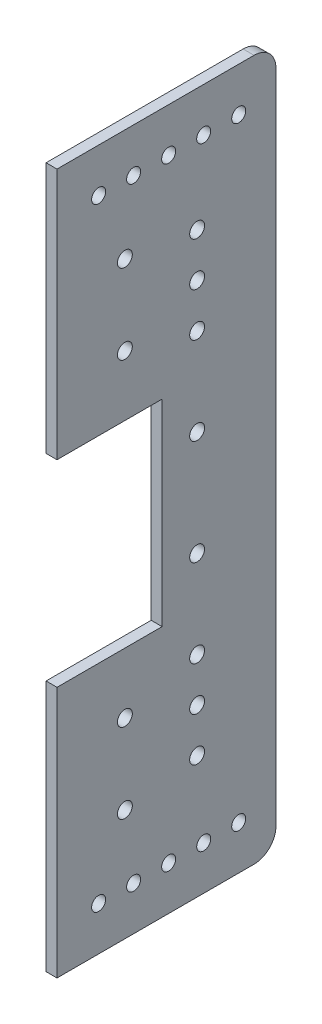
ISO-10303-21;
HEADER;
FILE_DESCRIPTION(('STEP AP214'),'2;1');
FILE_NAME('part.step','',(''),(''),'','','');
FILE_SCHEMA(('AUTOMOTIVE_DESIGN { 1 0 10303 214 1 1 1 1 }'));
ENDSEC;
DATA;
#1=APPLICATION_CONTEXT('core data for automotive mechanical design processes');
#2=APPLICATION_PROTOCOL_DEFINITION('international standard','automotive_design',2000,#1);
#3=PRODUCT_CONTEXT('',#1,'mechanical');
#4=PRODUCT('Part','Part','',(#3));
#5=PRODUCT_RELATED_PRODUCT_CATEGORY('part','',(#4));
#6=PRODUCT_DEFINITION_FORMATION('','',#4);
#7=PRODUCT_DEFINITION_CONTEXT('part definition',#1,'design');
#8=PRODUCT_DEFINITION('design','',#6,#7);
#9=PRODUCT_DEFINITION_SHAPE('','',#8);
#10=(LENGTH_UNIT() NAMED_UNIT(*) SI_UNIT(.MILLI.,.METRE.));
#11=(NAMED_UNIT(*) PLANE_ANGLE_UNIT() SI_UNIT($,.RADIAN.));
#12=(NAMED_UNIT(*) SI_UNIT($,.STERADIAN.) SOLID_ANGLE_UNIT());
#13=UNCERTAINTY_MEASURE_WITH_UNIT(LENGTH_MEASURE(1.E-05),#10,'distance_accuracy_value','');
#14=(GEOMETRIC_REPRESENTATION_CONTEXT(3) GLOBAL_UNCERTAINTY_ASSIGNED_CONTEXT((#13)) GLOBAL_UNIT_ASSIGNED_CONTEXT((#10,
#11,#12)) REPRESENTATION_CONTEXT('',''));
#15=CARTESIAN_POINT('',(0.,0.,0.));
#16=DIRECTION('',(0.,0.,1.));
#17=DIRECTION('',(1.,0.,0.));
#18=AXIS2_PLACEMENT_3D('',#15,#16,#17);
#19=CARTESIAN_POINT('',(0.,0.,0.));
#20=DIRECTION('',(0.,0.,-1.));
#21=DIRECTION('',(-1.,0.,0.));
#22=AXIS2_PLACEMENT_3D('',#19,#20,#21);
#23=PLANE('',#22);
#24=DIRECTION('',(1.,0.,0.));
#25=VECTOR('',#24,1.);
#26=CARTESIAN_POINT('',(79.5,102.5,0.));
#27=LINE('',#26,#25);
#28=CARTESIAN_POINT('',(79.5,102.5,0.));
#29=VERTEX_POINT('',#28);
#30=CARTESIAN_POINT('',(82.,102.5,0.));
#31=VERTEX_POINT('',#30);
#32=EDGE_CURVE('E120',#29,#31,#27,.T.);
#33=ORIENTED_EDGE('',*,*,#32,.T.);
#34=DIRECTION('',(0.,-1.,0.));
#35=VECTOR('',#34,1.);
#36=CARTESIAN_POINT('',(82.,160.,0.));
#37=LINE('',#36,#35);
#38=CARTESIAN_POINT('',(82.,160.,0.));
#39=VERTEX_POINT('',#38);
#40=EDGE_CURVE('E208',#39,#31,#37,.T.);
#41=ORIENTED_EDGE('',*,*,#40,.F.);
#42=DIRECTION('',(1.,0.,0.));
#43=VECTOR('',#42,1.);
#44=CARTESIAN_POINT('',(0.,160.,0.));
#45=LINE('',#44,#43);
#46=CARTESIAN_POINT('',(79.5,160.,0.));
#47=VERTEX_POINT('',#46);
#48=EDGE_CURVE('E144',#47,#39,#45,.T.);
#49=ORIENTED_EDGE('',*,*,#48,.F.);
#50=DIRECTION('',(0.,1.,0.));
#51=VECTOR('',#50,1.);
#52=CARTESIAN_POINT('',(79.5,0.,0.));
#53=LINE('',#52,#51);
#54=EDGE_CURVE('E137',#29,#47,#53,.T.);
#55=ORIENTED_EDGE('',*,*,#54,.F.);
#56=EDGE_LOOP('',(#33,#41,#49,#55));
#57=FACE_BOUND('',#56,.T.);
#58=ADVANCED_FACE('F45',(#57),#23,.F.);
#59=DIRECTION('',(1.,0.,0.));
#60=VECTOR('',#59,1.);
#61=CARTESIAN_POINT('',(79.5,57.5,0.));
#62=LINE('',#61,#60);
#63=CARTESIAN_POINT('',(79.5,57.5,0.));
#64=VERTEX_POINT('',#63);
#65=CARTESIAN_POINT('',(82.,57.5,0.));
#66=VERTEX_POINT('',#65);
#67=EDGE_CURVE('E390',#64,#66,#62,.T.);
#68=ORIENTED_EDGE('',*,*,#67,.F.);
#69=CARTESIAN_POINT('',(79.5,0.,0.));
#70=VERTEX_POINT('',#69);
#71=EDGE_CURVE('E145',#70,#64,#53,.T.);
#72=ORIENTED_EDGE('',*,*,#71,.F.);
#73=DIRECTION('',(-1.,0.,0.));
#74=VECTOR('',#73,1.);
#75=CARTESIAN_POINT('',(82.,0.,0.));
#76=LINE('',#75,#74);
#77=CARTESIAN_POINT('',(82.,0.,0.));
#78=VERTEX_POINT('',#77);
#79=EDGE_CURVE('E210',#78,#70,#76,.T.);
#80=ORIENTED_EDGE('',*,*,#79,.F.);
#81=EDGE_CURVE('E211',#66,#78,#37,.T.);
#82=ORIENTED_EDGE('',*,*,#81,.F.);
#83=EDGE_LOOP('',(#68,#72,#80,#82));
#84=FACE_BOUND('',#83,.T.);
#85=ADVANCED_FACE('F276',(#84),#23,.F.);
#86=CARTESIAN_POINT('',(82.,160.,0.));
#87=DIRECTION('',(1.,0.,0.));
#88=DIRECTION('',(0.,0.,-1.));
#89=AXIS2_PLACEMENT_3D('',#86,#87,#88);
#90=PLANE('',#89);
#91=CARTESIAN_POINT('',(82.,38.,-32.));
#92=DIRECTION('',(1.,0.,0.));
#93=DIRECTION('',(0.,0.,-1.));
#94=AXIS2_PLACEMENT_3D('',#91,#92,#93);
#95=CIRCLE('',#94,1.7);
#96=CARTESIAN_POINT('',(82.,38.,-33.7));
#97=VERTEX_POINT('',#96);
#98=EDGE_CURVE('E411',#97,#97,#95,.T.);
#99=ORIENTED_EDGE('',*,*,#98,.F.);
#100=EDGE_LOOP('',(#99));
#101=FACE_BOUND('',#100,.T.);
#102=CARTESIAN_POINT('',(82.,68.,-32.));
#103=DIRECTION('',(1.,0.,0.));
#104=DIRECTION('',(0.,0.,-1.));
#105=AXIS2_PLACEMENT_3D('',#102,#103,#104);
#106=CIRCLE('',#105,1.7);
#107=CARTESIAN_POINT('',(82.,68.,-33.7));
#108=VERTEX_POINT('',#107);
#109=EDGE_CURVE('E406',#108,#108,#106,.T.);
#110=ORIENTED_EDGE('',*,*,#109,.F.);
#111=EDGE_LOOP('',(#110));
#112=FACE_BOUND('',#111,.T.);
#113=CARTESIAN_POINT('',(82.,122.,-32.));
#114=DIRECTION('',(1.,0.,0.));
#115=DIRECTION('',(0.,0.,-1.));
#116=AXIS2_PLACEMENT_3D('',#113,#114,#115);
#117=CIRCLE('',#116,1.7);
#118=CARTESIAN_POINT('',(82.,122.,-33.7));
#119=VERTEX_POINT('',#118);
#120=EDGE_CURVE('E423',#119,#119,#117,.T.);
#121=ORIENTED_EDGE('',*,*,#120,.F.);
#122=EDGE_LOOP('',(#121));
#123=FACE_BOUND('',#122,.T.);
#124=CARTESIAN_POINT('',(82.,92.,-32.));
#125=DIRECTION('',(1.,0.,0.));
#126=DIRECTION('',(0.,0.,-1.));
#127=AXIS2_PLACEMENT_3D('',#124,#125,#126);
#128=CIRCLE('',#127,1.7);
#129=CARTESIAN_POINT('',(82.,92.,-33.7));
#130=VERTEX_POINT('',#129);
#131=EDGE_CURVE('E418',#130,#130,#128,.T.);
#132=ORIENTED_EDGE('',*,*,#131,.F.);
#133=EDGE_LOOP('',(#132));
#134=FACE_BOUND('',#133,.T.);
#135=CARTESIAN_POINT('',(82.,28.,-32.));
#136=DIRECTION('',(1.,0.,0.));
#137=DIRECTION('',(0.,0.,-1.));
#138=AXIS2_PLACEMENT_3D('',#135,#136,#137);
#139=CIRCLE('',#138,1.7);
#140=CARTESIAN_POINT('',(82.,28.,-33.7));
#141=VERTEX_POINT('',#140);
#142=EDGE_CURVE('E435',#141,#141,#139,.T.);
#143=ORIENTED_EDGE('',*,*,#142,.F.);
#144=EDGE_LOOP('',(#143));
#145=FACE_BOUND('',#144,.T.);
#146=CARTESIAN_POINT('',(82.,48.,-32.));
#147=DIRECTION('',(1.,0.,0.));
#148=DIRECTION('',(0.,0.,-1.));
#149=AXIS2_PLACEMENT_3D('',#146,#147,#148);
#150=CIRCLE('',#149,1.7);
#151=CARTESIAN_POINT('',(82.,48.,-33.7));
#152=VERTEX_POINT('',#151);
#153=EDGE_CURVE('E430',#152,#152,#150,.T.);
#154=ORIENTED_EDGE('',*,*,#153,.F.);
#155=EDGE_LOOP('',(#154));
#156=FACE_BOUND('',#155,.T.);
#157=CARTESIAN_POINT('',(82.,132.,-32.));
#158=DIRECTION('',(1.,0.,0.));
#159=DIRECTION('',(0.,0.,-1.));
#160=AXIS2_PLACEMENT_3D('',#157,#158,#159);
#161=CIRCLE('',#160,1.7);
#162=CARTESIAN_POINT('',(82.,132.,-33.7));
#163=VERTEX_POINT('',#162);
#164=EDGE_CURVE('E447',#163,#163,#161,.T.);
#165=ORIENTED_EDGE('',*,*,#164,.F.);
#166=EDGE_LOOP('',(#165));
#167=FACE_BOUND('',#166,.T.);
#168=CARTESIAN_POINT('',(82.,112.,-32.));
#169=DIRECTION('',(1.,0.,0.));
#170=DIRECTION('',(0.,0.,-1.));
#171=AXIS2_PLACEMENT_3D('',#168,#169,#170);
#172=CIRCLE('',#171,1.7);
#173=CARTESIAN_POINT('',(82.,112.,-33.7));
#174=VERTEX_POINT('',#173);
#175=EDGE_CURVE('E442',#174,#174,#172,.T.);
#176=ORIENTED_EDGE('',*,*,#175,.F.);
#177=EDGE_LOOP('',(#176));
#178=FACE_BOUND('',#177,.T.);
#179=CARTESIAN_POINT('',(82.,43.7,-15.5));
#180=DIRECTION('',(1.,0.,0.));
#181=DIRECTION('',(0.,0.,-1.));
#182=AXIS2_PLACEMENT_3D('',#179,#180,#181);
#183=CIRCLE('',#182,1.7);
#184=CARTESIAN_POINT('',(82.,43.7,-17.2));
#185=VERTEX_POINT('',#184);
#186=EDGE_CURVE('E459',#185,#185,#183,.T.);
#187=ORIENTED_EDGE('',*,*,#186,.F.);
#188=EDGE_LOOP('',(#187));
#189=FACE_BOUND('',#188,.T.);
#190=CARTESIAN_POINT('',(82.,25.5,-15.5));
#191=DIRECTION('',(1.,0.,0.));
#192=DIRECTION('',(0.,0.,-1.));
#193=AXIS2_PLACEMENT_3D('',#190,#191,#192);
#194=CIRCLE('',#193,1.7);
#195=CARTESIAN_POINT('',(82.,25.5,-17.2));
#196=VERTEX_POINT('',#195);
#197=EDGE_CURVE('E454',#196,#196,#194,.T.);
#198=ORIENTED_EDGE('',*,*,#197,.F.);
#199=EDGE_LOOP('',(#198));
#200=FACE_BOUND('',#199,.T.);
#201=CARTESIAN_POINT('',(82.,134.5,-15.5));
#202=DIRECTION('',(1.,0.,0.));
#203=DIRECTION('',(0.,0.,-1.));
#204=AXIS2_PLACEMENT_3D('',#201,#202,#203);
#205=CIRCLE('',#204,1.7);
#206=CARTESIAN_POINT('',(82.,134.5,-17.2));
#207=VERTEX_POINT('',#206);
#208=EDGE_CURVE('E146',#207,#207,#205,.T.);
#209=ORIENTED_EDGE('',*,*,#208,.F.);
#210=EDGE_LOOP('',(#209));
#211=FACE_BOUND('',#210,.T.);
#212=CARTESIAN_POINT('',(82.,116.3,-15.5));
#213=DIRECTION('',(1.,0.,0.));
#214=DIRECTION('',(0.,0.,-1.));
#215=AXIS2_PLACEMENT_3D('',#212,#213,#214);
#216=CIRCLE('',#215,1.7);
#217=CARTESIAN_POINT('',(82.,116.3,-17.2));
#218=VERTEX_POINT('',#217);
#219=EDGE_CURVE('E151',#218,#218,#216,.T.);
#220=ORIENTED_EDGE('',*,*,#219,.F.);
#221=EDGE_LOOP('',(#220));
#222=FACE_BOUND('',#221,.T.);
#223=CARTESIAN_POINT('',(82.,150.,-9.50000000000295));
#224=DIRECTION('',(1.,0.,0.));
#225=DIRECTION('',(0.,0.,-1.));
#226=AXIS2_PLACEMENT_3D('',#223,#224,#225);
#227=CIRCLE('',#226,1.60000000000279);
#228=CARTESIAN_POINT('',(82.,150.,-11.1000000000057));
#229=VERTEX_POINT('',#228);
#230=EDGE_CURVE('E149',#229,#229,#227,.T.);
#231=ORIENTED_EDGE('',*,*,#230,.F.);
#232=EDGE_LOOP('',(#231));
#233=FACE_BOUND('',#232,.T.);
#234=CARTESIAN_POINT('',(82.,150.,-17.500000000003));
#235=DIRECTION('',(1.,0.,0.));
#236=DIRECTION('',(0.,0.,-1.));
#237=AXIS2_PLACEMENT_3D('',#234,#235,#236);
#238=CIRCLE('',#237,1.60000000000279);
#239=CARTESIAN_POINT('',(82.,150.,-19.1000000000057));
#240=VERTEX_POINT('',#239);
#241=EDGE_CURVE('E158',#240,#240,#238,.T.);
#242=ORIENTED_EDGE('',*,*,#241,.F.);
#243=EDGE_LOOP('',(#242));
#244=FACE_BOUND('',#243,.T.);
#245=CARTESIAN_POINT('',(82.,150.,-25.5000000000024));
#246=DIRECTION('',(1.,0.,0.));
#247=DIRECTION('',(0.,0.,-1.));
#248=AXIS2_PLACEMENT_3D('',#245,#246,#247);
#249=CIRCLE('',#248,1.60000000000279);
#250=CARTESIAN_POINT('',(82.,150.,-27.1000000000052));
#251=VERTEX_POINT('',#250);
#252=EDGE_CURVE('E164',#251,#251,#249,.T.);
#253=ORIENTED_EDGE('',*,*,#252,.F.);
#254=EDGE_LOOP('',(#253));
#255=FACE_BOUND('',#254,.T.);
#256=CARTESIAN_POINT('',(82.,150.,-33.500000000002));
#257=DIRECTION('',(1.,0.,0.));
#258=DIRECTION('',(0.,0.,-1.));
#259=AXIS2_PLACEMENT_3D('',#256,#257,#258);
#260=CIRCLE('',#259,1.60000000000279);
#261=CARTESIAN_POINT('',(82.,150.,-35.1000000000048));
#262=VERTEX_POINT('',#261);
#263=EDGE_CURVE('E168',#262,#262,#260,.T.);
#264=ORIENTED_EDGE('',*,*,#263,.F.);
#265=EDGE_LOOP('',(#264));
#266=FACE_BOUND('',#265,.T.);
#267=CARTESIAN_POINT('',(82.,150.,-41.500000000002));
#268=DIRECTION('',(1.,0.,0.));
#269=DIRECTION('',(0.,0.,-1.));
#270=AXIS2_PLACEMENT_3D('',#267,#268,#269);
#271=CIRCLE('',#270,1.60000000000279);
#272=CARTESIAN_POINT('',(82.,150.,-43.1000000000048));
#273=VERTEX_POINT('',#272);
#274=EDGE_CURVE('E172',#273,#273,#271,.T.);
#275=ORIENTED_EDGE('',*,*,#274,.F.);
#276=EDGE_LOOP('',(#275));
#277=FACE_BOUND('',#276,.T.);
#278=CARTESIAN_POINT('',(82.,9.99999999999968,-41.500000000001));
#279=DIRECTION('',(1.,0.,0.));
#280=DIRECTION('',(0.,0.,-1.));
#281=AXIS2_PLACEMENT_3D('',#278,#279,#280);
#282=CIRCLE('',#281,1.60000000000278);
#283=CARTESIAN_POINT('',(82.,9.99999999999968,-43.1000000000038));
#284=VERTEX_POINT('',#283);
#285=EDGE_CURVE('E178',#284,#284,#282,.T.);
#286=ORIENTED_EDGE('',*,*,#285,.F.);
#287=EDGE_LOOP('',(#286));
#288=FACE_BOUND('',#287,.T.);
#289=CARTESIAN_POINT('',(82.,9.99999999999973,-33.500000000001));
#290=DIRECTION('',(1.,0.,0.));
#291=DIRECTION('',(0.,0.,-1.));
#292=AXIS2_PLACEMENT_3D('',#289,#290,#291);
#293=CIRCLE('',#292,1.60000000000278);
#294=CARTESIAN_POINT('',(82.,9.99999999999973,-35.1000000000038));
#295=VERTEX_POINT('',#294);
#296=EDGE_CURVE('E182',#295,#295,#293,.T.);
#297=ORIENTED_EDGE('',*,*,#296,.F.);
#298=EDGE_LOOP('',(#297));
#299=FACE_BOUND('',#298,.T.);
#300=CARTESIAN_POINT('',(82.,9.99999999999979,-25.5000000000015));
#301=DIRECTION('',(1.,0.,0.));
#302=DIRECTION('',(0.,0.,-1.));
#303=AXIS2_PLACEMENT_3D('',#300,#301,#302);
#304=CIRCLE('',#303,1.60000000000278);
#305=CARTESIAN_POINT('',(82.,9.99999999999979,-27.1000000000043));
#306=VERTEX_POINT('',#305);
#307=EDGE_CURVE('E186',#306,#306,#304,.T.);
#308=ORIENTED_EDGE('',*,*,#307,.F.);
#309=EDGE_LOOP('',(#308));
#310=FACE_BOUND('',#309,.T.);
#311=CARTESIAN_POINT('',(82.,10.,-17.500000000002));
#312=DIRECTION('',(1.,0.,0.));
#313=DIRECTION('',(0.,0.,-1.));
#314=AXIS2_PLACEMENT_3D('',#311,#312,#313);
#315=CIRCLE('',#314,1.60000000000278);
#316=CARTESIAN_POINT('',(82.,10.,-19.1000000000048));
#317=VERTEX_POINT('',#316);
#318=EDGE_CURVE('E190',#317,#317,#315,.T.);
#319=ORIENTED_EDGE('',*,*,#318,.F.);
#320=EDGE_LOOP('',(#319));
#321=FACE_BOUND('',#320,.T.);
#322=CARTESIAN_POINT('',(82.,10.,-9.50000000000198));
#323=DIRECTION('',(1.,0.,0.));
#324=DIRECTION('',(0.,0.,-1.));
#325=AXIS2_PLACEMENT_3D('',#322,#323,#324);
#326=CIRCLE('',#325,1.60000000000278);
#327=CARTESIAN_POINT('',(82.,10.,-11.1000000000048));
#328=VERTEX_POINT('',#327);
#329=EDGE_CURVE('E194',#328,#328,#326,.T.);
#330=ORIENTED_EDGE('',*,*,#329,.F.);
#331=EDGE_LOOP('',(#330));
#332=FACE_BOUND('',#331,.T.);
#333=ORIENTED_EDGE('',*,*,#40,.T.);
#334=DIRECTION('',(0.,0.,-1.));
#335=VECTOR('',#334,1.);
#336=CARTESIAN_POINT('',(82.,102.5,0.));
#337=LINE('',#336,#335);
#338=CARTESIAN_POINT('',(82.,102.5,-24.));
#339=VERTEX_POINT('',#338);
#340=EDGE_CURVE('E126',#31,#339,#337,.T.);
#341=ORIENTED_EDGE('',*,*,#340,.T.);
#342=DIRECTION('',(0.,-1.,0.));
#343=VECTOR('',#342,1.);
#344=CARTESIAN_POINT('',(82.,102.5,-24.));
#345=LINE('',#344,#343);
#346=CARTESIAN_POINT('',(82.,57.5,-24.));
#347=VERTEX_POINT('',#346);
#348=EDGE_CURVE('E392',#339,#347,#345,.T.);
#349=ORIENTED_EDGE('',*,*,#348,.T.);
#350=DIRECTION('',(0.,0.,1.));
#351=VECTOR('',#350,1.);
#352=CARTESIAN_POINT('',(82.,57.5,-24.));
#353=LINE('',#352,#351);
#354=EDGE_CURVE('E141',#347,#66,#353,.T.);
#355=ORIENTED_EDGE('',*,*,#354,.T.);
#356=ORIENTED_EDGE('',*,*,#81,.T.);
#357=DIRECTION('',(0.,0.,-1.));
#358=VECTOR('',#357,1.);
#359=CARTESIAN_POINT('',(82.,0.,0.));
#360=LINE('',#359,#358);
#361=CARTESIAN_POINT('',(82.,0.,-45.));
#362=VERTEX_POINT('',#361);
#363=EDGE_CURVE('E215',#78,#362,#360,.T.);
#364=ORIENTED_EDGE('',*,*,#363,.T.);
#365=CARTESIAN_POINT('',(82.,5.,-45.));
#366=DIRECTION('',(1.,0.,0.));
#367=DIRECTION('',(0.,0.,-1.));
#368=AXIS2_PLACEMENT_3D('',#365,#366,#367);
#369=CIRCLE('',#368,5.);
#370=CARTESIAN_POINT('',(82.,5.,-50.));
#371=VERTEX_POINT('',#370);
#372=EDGE_CURVE('E243',#362,#371,#369,.T.);
#373=ORIENTED_EDGE('',*,*,#372,.T.);
#374=DIRECTION('',(0.,-1.,0.));
#375=VECTOR('',#374,1.);
#376=CARTESIAN_POINT('',(82.,160.,-50.));
#377=LINE('',#376,#375);
#378=CARTESIAN_POINT('',(82.,155.,-50.));
#379=VERTEX_POINT('',#378);
#380=EDGE_CURVE('E207',#379,#371,#377,.T.);
#381=ORIENTED_EDGE('',*,*,#380,.F.);
#382=CARTESIAN_POINT('',(82.,155.,-45.));
#383=DIRECTION('',(1.,0.,0.));
#384=DIRECTION('',(0.,0.,-1.));
#385=AXIS2_PLACEMENT_3D('',#382,#383,#384);
#386=CIRCLE('',#385,5.);
#387=CARTESIAN_POINT('',(82.,160.,-45.));
#388=VERTEX_POINT('',#387);
#389=EDGE_CURVE('E245',#379,#388,#386,.T.);
#390=ORIENTED_EDGE('',*,*,#389,.T.);
#391=DIRECTION('',(0.,0.,-1.));
#392=VECTOR('',#391,1.);
#393=CARTESIAN_POINT('',(82.,160.,0.));
#394=LINE('',#393,#392);
#395=EDGE_CURVE('E218',#39,#388,#394,.T.);
#396=ORIENTED_EDGE('',*,*,#395,.F.);
#397=EDGE_LOOP('',(#333,#341,#349,#355,#356,#364,#373,#381,#390,#396));
#398=FACE_BOUND('',#397,.T.);
#399=ADVANCED_FACE('F260',(#101,#112,#123,#134,#145,#156,#167,#178,#189,#200,#211,#222,#233,
#244,#255,#266,#277,#288,#299,#310,#321,#332,#398),#90,.T.);
#400=CARTESIAN_POINT('',(79.5,0.,-2.5));
#401=DIRECTION('',(1.,0.,0.));
#402=DIRECTION('',(0.,0.,-1.));
#403=AXIS2_PLACEMENT_3D('',#400,#401,#402);
#404=PLANE('',#403);
#405=CARTESIAN_POINT('',(79.5,10.,-9.50000000000198));
#406=DIRECTION('',(1.,0.,0.));
#407=DIRECTION('',(0.,0.,-1.));
#408=AXIS2_PLACEMENT_3D('',#405,#406,#407);
#409=CIRCLE('',#408,1.60000000000278);
#410=CARTESIAN_POINT('',(79.5,10.,-11.1000000000048));
#411=VERTEX_POINT('',#410);
#412=EDGE_CURVE('E197',#411,#411,#409,.T.);
#413=ORIENTED_EDGE('',*,*,#412,.T.);
#414=EDGE_LOOP('',(#413));
#415=FACE_BOUND('',#414,.T.);
#416=CARTESIAN_POINT('',(79.5,10.,-17.500000000002));
#417=DIRECTION('',(1.,0.,0.));
#418=DIRECTION('',(0.,0.,-1.));
#419=AXIS2_PLACEMENT_3D('',#416,#417,#418);
#420=CIRCLE('',#419,1.60000000000278);
#421=CARTESIAN_POINT('',(79.5,10.,-19.1000000000048));
#422=VERTEX_POINT('',#421);
#423=EDGE_CURVE('E193',#422,#422,#420,.T.);
#424=ORIENTED_EDGE('',*,*,#423,.T.);
#425=EDGE_LOOP('',(#424));
#426=FACE_BOUND('',#425,.T.);
#427=CARTESIAN_POINT('',(79.5,9.99999999999979,-25.5000000000015));
#428=DIRECTION('',(1.,0.,0.));
#429=DIRECTION('',(0.,0.,-1.));
#430=AXIS2_PLACEMENT_3D('',#427,#428,#429);
#431=CIRCLE('',#430,1.60000000000278);
#432=CARTESIAN_POINT('',(79.5,9.99999999999979,-27.1000000000043));
#433=VERTEX_POINT('',#432);
#434=EDGE_CURVE('E189',#433,#433,#431,.T.);
#435=ORIENTED_EDGE('',*,*,#434,.T.);
#436=EDGE_LOOP('',(#435));
#437=FACE_BOUND('',#436,.T.);
#438=CARTESIAN_POINT('',(79.5,9.99999999999973,-33.500000000001));
#439=DIRECTION('',(1.,0.,0.));
#440=DIRECTION('',(0.,0.,-1.));
#441=AXIS2_PLACEMENT_3D('',#438,#439,#440);
#442=CIRCLE('',#441,1.60000000000278);
#443=CARTESIAN_POINT('',(79.5,9.99999999999973,-35.1000000000038));
#444=VERTEX_POINT('',#443);
#445=EDGE_CURVE('E185',#444,#444,#442,.T.);
#446=ORIENTED_EDGE('',*,*,#445,.T.);
#447=EDGE_LOOP('',(#446));
#448=FACE_BOUND('',#447,.T.);
#449=CARTESIAN_POINT('',(79.5,9.99999999999968,-41.500000000001));
#450=DIRECTION('',(1.,0.,0.));
#451=DIRECTION('',(0.,0.,-1.));
#452=AXIS2_PLACEMENT_3D('',#449,#450,#451);
#453=CIRCLE('',#452,1.60000000000278);
#454=CARTESIAN_POINT('',(79.5,9.99999999999968,-43.1000000000038));
#455=VERTEX_POINT('',#454);
#456=EDGE_CURVE('E181',#455,#455,#453,.T.);
#457=ORIENTED_EDGE('',*,*,#456,.T.);
#458=EDGE_LOOP('',(#457));
#459=FACE_BOUND('',#458,.T.);
#460=CARTESIAN_POINT('',(79.5,150.,-41.500000000002));
#461=DIRECTION('',(1.,0.,0.));
#462=DIRECTION('',(0.,0.,-1.));
#463=AXIS2_PLACEMENT_3D('',#460,#461,#462);
#464=CIRCLE('',#463,1.60000000000278);
#465=CARTESIAN_POINT('',(79.5,150.,-43.1000000000048));
#466=VERTEX_POINT('',#465);
#467=EDGE_CURVE('E175',#466,#466,#464,.T.);
#468=ORIENTED_EDGE('',*,*,#467,.T.);
#469=EDGE_LOOP('',(#468));
#470=FACE_BOUND('',#469,.T.);
#471=CARTESIAN_POINT('',(79.5,150.,-33.500000000002));
#472=DIRECTION('',(1.,0.,0.));
#473=DIRECTION('',(0.,0.,-1.));
#474=AXIS2_PLACEMENT_3D('',#471,#472,#473);
#475=CIRCLE('',#474,1.60000000000278);
#476=CARTESIAN_POINT('',(79.5,150.,-35.1000000000048));
#477=VERTEX_POINT('',#476);
#478=EDGE_CURVE('E171',#477,#477,#475,.T.);
#479=ORIENTED_EDGE('',*,*,#478,.T.);
#480=EDGE_LOOP('',(#479));
#481=FACE_BOUND('',#480,.T.);
#482=CARTESIAN_POINT('',(79.5,150.,-25.5000000000024));
#483=DIRECTION('',(1.,0.,0.));
#484=DIRECTION('',(0.,0.,-1.));
#485=AXIS2_PLACEMENT_3D('',#482,#483,#484);
#486=CIRCLE('',#485,1.60000000000278);
#487=CARTESIAN_POINT('',(79.5,150.,-27.1000000000052));
#488=VERTEX_POINT('',#487);
#489=EDGE_CURVE('E167',#488,#488,#486,.T.);
#490=ORIENTED_EDGE('',*,*,#489,.T.);
#491=EDGE_LOOP('',(#490));
#492=FACE_BOUND('',#491,.T.);
#493=CARTESIAN_POINT('',(79.5,150.,-17.500000000003));
#494=DIRECTION('',(1.,0.,0.));
#495=DIRECTION('',(0.,0.,-1.));
#496=AXIS2_PLACEMENT_3D('',#493,#494,#495);
#497=CIRCLE('',#496,1.60000000000278);
#498=CARTESIAN_POINT('',(79.5,150.,-19.1000000000057));
#499=VERTEX_POINT('',#498);
#500=EDGE_CURVE('E161',#499,#499,#497,.T.);
#501=ORIENTED_EDGE('',*,*,#500,.T.);
#502=EDGE_LOOP('',(#501));
#503=FACE_BOUND('',#502,.T.);
#504=CARTESIAN_POINT('',(79.5,150.,-9.50000000000295));
#505=DIRECTION('',(1.,0.,0.));
#506=DIRECTION('',(0.,0.,-1.));
#507=AXIS2_PLACEMENT_3D('',#504,#505,#506);
#508=CIRCLE('',#507,1.60000000000278);
#509=CARTESIAN_POINT('',(79.5,150.,-11.1000000000057));
#510=VERTEX_POINT('',#509);
#511=EDGE_CURVE('E157',#510,#510,#508,.T.);
#512=ORIENTED_EDGE('',*,*,#511,.T.);
#513=EDGE_LOOP('',(#512));
#514=FACE_BOUND('',#513,.T.);
#515=CARTESIAN_POINT('',(79.5,116.3,-15.5));
#516=DIRECTION('',(-1.,0.,0.));
#517=DIRECTION('',(0.,0.,1.));
#518=AXIS2_PLACEMENT_3D('',#515,#516,#517);
#519=CIRCLE('',#518,1.7);
#520=CARTESIAN_POINT('',(79.5,116.3,-13.8));
#521=VERTEX_POINT('',#520);
#522=EDGE_CURVE('E462',#521,#521,#519,.T.);
#523=ORIENTED_EDGE('',*,*,#522,.F.);
#524=EDGE_LOOP('',(#523));
#525=FACE_BOUND('',#524,.T.);
#526=CARTESIAN_POINT('',(79.5,134.5,-15.5));
#527=DIRECTION('',(-1.,0.,0.));
#528=DIRECTION('',(0.,0.,1.));
#529=AXIS2_PLACEMENT_3D('',#526,#527,#528);
#530=CIRCLE('',#529,1.7);
#531=CARTESIAN_POINT('',(79.5,134.5,-13.8));
#532=VERTEX_POINT('',#531);
#533=EDGE_CURVE('E463',#532,#532,#530,.T.);
#534=ORIENTED_EDGE('',*,*,#533,.F.);
#535=EDGE_LOOP('',(#534));
#536=FACE_BOUND('',#535,.T.);
#537=CARTESIAN_POINT('',(79.5,25.5,-15.5));
#538=DIRECTION('',(-1.,0.,0.));
#539=DIRECTION('',(0.,0.,1.));
#540=AXIS2_PLACEMENT_3D('',#537,#538,#539);
#541=CIRCLE('',#540,1.7);
#542=CARTESIAN_POINT('',(79.5,25.5,-13.8));
#543=VERTEX_POINT('',#542);
#544=EDGE_CURVE('E450',#543,#543,#541,.T.);
#545=ORIENTED_EDGE('',*,*,#544,.F.);
#546=EDGE_LOOP('',(#545));
#547=FACE_BOUND('',#546,.T.);
#548=CARTESIAN_POINT('',(79.5,43.7,-15.5));
#549=DIRECTION('',(-1.,0.,0.));
#550=DIRECTION('',(0.,0.,1.));
#551=AXIS2_PLACEMENT_3D('',#548,#549,#550);
#552=CIRCLE('',#551,1.7);
#553=CARTESIAN_POINT('',(79.5,43.7,-13.8));
#554=VERTEX_POINT('',#553);
#555=EDGE_CURVE('E451',#554,#554,#552,.T.);
#556=ORIENTED_EDGE('',*,*,#555,.F.);
#557=EDGE_LOOP('',(#556));
#558=FACE_BOUND('',#557,.T.);
#559=CARTESIAN_POINT('',(79.5,112.,-32.));
#560=DIRECTION('',(-1.,0.,0.));
#561=DIRECTION('',(0.,0.,1.));
#562=AXIS2_PLACEMENT_3D('',#559,#560,#561);
#563=CIRCLE('',#562,1.7);
#564=CARTESIAN_POINT('',(79.5,112.,-30.3));
#565=VERTEX_POINT('',#564);
#566=EDGE_CURVE('E438',#565,#565,#563,.T.);
#567=ORIENTED_EDGE('',*,*,#566,.F.);
#568=EDGE_LOOP('',(#567));
#569=FACE_BOUND('',#568,.T.);
#570=CARTESIAN_POINT('',(79.5,132.,-32.));
#571=DIRECTION('',(-1.,0.,0.));
#572=DIRECTION('',(0.,0.,1.));
#573=AXIS2_PLACEMENT_3D('',#570,#571,#572);
#574=CIRCLE('',#573,1.7);
#575=CARTESIAN_POINT('',(79.5,132.,-30.3));
#576=VERTEX_POINT('',#575);
#577=EDGE_CURVE('E439',#576,#576,#574,.T.);
#578=ORIENTED_EDGE('',*,*,#577,.F.);
#579=EDGE_LOOP('',(#578));
#580=FACE_BOUND('',#579,.T.);
#581=CARTESIAN_POINT('',(79.5,48.,-32.));
#582=DIRECTION('',(-1.,0.,0.));
#583=DIRECTION('',(0.,0.,1.));
#584=AXIS2_PLACEMENT_3D('',#581,#582,#583);
#585=CIRCLE('',#584,1.7);
#586=CARTESIAN_POINT('',(79.5,48.,-30.3));
#587=VERTEX_POINT('',#586);
#588=EDGE_CURVE('E426',#587,#587,#585,.T.);
#589=ORIENTED_EDGE('',*,*,#588,.F.);
#590=EDGE_LOOP('',(#589));
#591=FACE_BOUND('',#590,.T.);
#592=CARTESIAN_POINT('',(79.5,28.,-32.));
#593=DIRECTION('',(-1.,0.,0.));
#594=DIRECTION('',(0.,0.,1.));
#595=AXIS2_PLACEMENT_3D('',#592,#593,#594);
#596=CIRCLE('',#595,1.7);
#597=CARTESIAN_POINT('',(79.5,28.,-30.3));
#598=VERTEX_POINT('',#597);
#599=EDGE_CURVE('E427',#598,#598,#596,.T.);
#600=ORIENTED_EDGE('',*,*,#599,.F.);
#601=EDGE_LOOP('',(#600));
#602=FACE_BOUND('',#601,.T.);
#603=CARTESIAN_POINT('',(79.5,92.,-32.));
#604=DIRECTION('',(-1.,0.,0.));
#605=DIRECTION('',(0.,0.,1.));
#606=AXIS2_PLACEMENT_3D('',#603,#604,#605);
#607=CIRCLE('',#606,1.7);
#608=CARTESIAN_POINT('',(79.5,92.,-30.3));
#609=VERTEX_POINT('',#608);
#610=EDGE_CURVE('E414',#609,#609,#607,.T.);
#611=ORIENTED_EDGE('',*,*,#610,.F.);
#612=EDGE_LOOP('',(#611));
#613=FACE_BOUND('',#612,.T.);
#614=CARTESIAN_POINT('',(79.5,122.,-32.));
#615=DIRECTION('',(-1.,0.,0.));
#616=DIRECTION('',(0.,0.,1.));
#617=AXIS2_PLACEMENT_3D('',#614,#615,#616);
#618=CIRCLE('',#617,1.7);
#619=CARTESIAN_POINT('',(79.5,122.,-30.3));
#620=VERTEX_POINT('',#619);
#621=EDGE_CURVE('E415',#620,#620,#618,.T.);
#622=ORIENTED_EDGE('',*,*,#621,.F.);
#623=EDGE_LOOP('',(#622));
#624=FACE_BOUND('',#623,.T.);
#625=CARTESIAN_POINT('',(79.5,68.,-32.));
#626=DIRECTION('',(-1.,0.,0.));
#627=DIRECTION('',(0.,0.,1.));
#628=AXIS2_PLACEMENT_3D('',#625,#626,#627);
#629=CIRCLE('',#628,1.7);
#630=CARTESIAN_POINT('',(79.5,68.,-30.3));
#631=VERTEX_POINT('',#630);
#632=EDGE_CURVE('E131',#631,#631,#629,.T.);
#633=ORIENTED_EDGE('',*,*,#632,.F.);
#634=EDGE_LOOP('',(#633));
#635=FACE_BOUND('',#634,.T.);
#636=CARTESIAN_POINT('',(79.5,38.,-32.));
#637=DIRECTION('',(-1.,0.,0.));
#638=DIRECTION('',(0.,0.,1.));
#639=AXIS2_PLACEMENT_3D('',#636,#637,#638);
#640=CIRCLE('',#639,1.7);
#641=CARTESIAN_POINT('',(79.5,38.,-30.3));
#642=VERTEX_POINT('',#641);
#643=EDGE_CURVE('E403',#642,#642,#640,.T.);
#644=ORIENTED_EDGE('',*,*,#643,.F.);
#645=EDGE_LOOP('',(#644));
#646=FACE_BOUND('',#645,.T.);
#647=DIRECTION('',(0.,0.,-1.));
#648=VECTOR('',#647,1.);
#649=CARTESIAN_POINT('',(79.5,102.5,0.));
#650=LINE('',#649,#648);
#651=CARTESIAN_POINT('',(79.5,102.5,-24.));
#652=VERTEX_POINT('',#651);
#653=EDGE_CURVE('E123',#29,#652,#650,.T.);
#654=ORIENTED_EDGE('',*,*,#653,.F.);
#655=ORIENTED_EDGE('',*,*,#54,.T.);
#656=DIRECTION('',(0.,0.,-1.));
#657=VECTOR('',#656,1.);
#658=CARTESIAN_POINT('',(79.5,160.,-2.5));
#659=LINE('',#658,#657);
#660=CARTESIAN_POINT('',(79.5,160.,-45.));
#661=VERTEX_POINT('',#660);
#662=EDGE_CURVE('E200',#47,#661,#659,.T.);
#663=ORIENTED_EDGE('',*,*,#662,.T.);
#664=CARTESIAN_POINT('',(79.5,155.,-45.));
#665=DIRECTION('',(1.,0.,0.));
#666=DIRECTION('',(0.,0.,-1.));
#667=AXIS2_PLACEMENT_3D('',#664,#665,#666);
#668=CIRCLE('',#667,5.);
#669=CARTESIAN_POINT('',(79.5,155.,-50.));
#670=VERTEX_POINT('',#669);
#671=EDGE_CURVE('E53',#661,#670,#668,.F.);
#672=ORIENTED_EDGE('',*,*,#671,.T.);
#673=DIRECTION('',(0.,1.,0.));
#674=VECTOR('',#673,1.);
#675=CARTESIAN_POINT('',(79.5,0.,-50.));
#676=LINE('',#675,#674);
#677=CARTESIAN_POINT('',(79.5,5.,-50.));
#678=VERTEX_POINT('',#677);
#679=EDGE_CURVE('E203',#678,#670,#676,.T.);
#680=ORIENTED_EDGE('',*,*,#679,.F.);
#681=CARTESIAN_POINT('',(79.5,5.,-45.));
#682=DIRECTION('',(1.,0.,0.));
#683=DIRECTION('',(0.,0.,-1.));
#684=AXIS2_PLACEMENT_3D('',#681,#682,#683);
#685=CIRCLE('',#684,5.);
#686=CARTESIAN_POINT('',(79.5,0.,-45.));
#687=VERTEX_POINT('',#686);
#688=EDGE_CURVE('E68',#678,#687,#685,.F.);
#689=ORIENTED_EDGE('',*,*,#688,.T.);
#690=DIRECTION('',(0.,0.,-1.));
#691=VECTOR('',#690,1.);
#692=CARTESIAN_POINT('',(79.5,0.,-2.5));
#693=LINE('',#692,#691);
#694=EDGE_CURVE('E201',#70,#687,#693,.T.);
#695=ORIENTED_EDGE('',*,*,#694,.F.);
#696=ORIENTED_EDGE('',*,*,#71,.T.);
#697=DIRECTION('',(0.,0.,1.));
#698=VECTOR('',#697,1.);
#699=CARTESIAN_POINT('',(79.5,57.5,-24.));
#700=LINE('',#699,#698);
#701=CARTESIAN_POINT('',(79.5,57.5,-24.));
#702=VERTEX_POINT('',#701);
#703=EDGE_CURVE('E400',#702,#64,#700,.T.);
#704=ORIENTED_EDGE('',*,*,#703,.F.);
#705=DIRECTION('',(0.,-1.,0.));
#706=VECTOR('',#705,1.);
#707=CARTESIAN_POINT('',(79.5,102.5,-24.));
#708=LINE('',#707,#706);
#709=EDGE_CURVE('E140',#652,#702,#708,.T.);
#710=ORIENTED_EDGE('',*,*,#709,.F.);
#711=EDGE_LOOP('',(#654,#655,#663,#672,#680,#689,#695,#696,#704,#710));
#712=FACE_BOUND('',#711,.T.);
#713=ADVANCED_FACE('F135',(#415,#426,#437,#448,#459,#470,#481,#492,#503,#514,#525,#536,#547,
#558,#569,#580,#591,#602,#613,#624,#635,#646,#712),#404,.F.);
#714=CARTESIAN_POINT('',(0.,160.,0.));
#715=DIRECTION('',(0.,1.,0.));
#716=DIRECTION('',(0.,0.,1.));
#717=AXIS2_PLACEMENT_3D('',#714,#715,#716);
#718=PLANE('',#717);
#719=ORIENTED_EDGE('',*,*,#662,.F.);
#720=ORIENTED_EDGE('',*,*,#48,.T.);
#721=ORIENTED_EDGE('',*,*,#395,.T.);
#722=DIRECTION('',(1.,0.,0.));
#723=VECTOR('',#722,1.);
#724=CARTESIAN_POINT('',(0.,160.,-45.));
#725=LINE('',#724,#723);
#726=EDGE_CURVE('E247',#388,#661,#725,.F.);
#727=ORIENTED_EDGE('',*,*,#726,.T.);
#728=EDGE_LOOP('',(#719,#720,#721,#727));
#729=FACE_BOUND('',#728,.T.);
#730=ADVANCED_FACE('F262',(#729),#718,.T.);
#731=CARTESIAN_POINT('',(82.,0.,0.));
#732=DIRECTION('',(0.,-1.,0.));
#733=DIRECTION('',(0.,0.,-1.));
#734=AXIS2_PLACEMENT_3D('',#731,#732,#733);
#735=PLANE('',#734);
#736=ORIENTED_EDGE('',*,*,#79,.T.);
#737=ORIENTED_EDGE('',*,*,#694,.T.);
#738=DIRECTION('',(-1.,0.,0.));
#739=VECTOR('',#738,1.);
#740=CARTESIAN_POINT('',(82.,0.,-45.));
#741=LINE('',#740,#739);
#742=EDGE_CURVE('E11',#687,#362,#741,.F.);
#743=ORIENTED_EDGE('',*,*,#742,.T.);
#744=ORIENTED_EDGE('',*,*,#363,.F.);
#745=EDGE_LOOP('',(#736,#737,#743,#744));
#746=FACE_BOUND('',#745,.T.);
#747=ADVANCED_FACE('F264',(#746),#735,.T.);
#748=CARTESIAN_POINT('',(0.,0.,-50.));
#749=DIRECTION('',(0.,0.,-1.));
#750=DIRECTION('',(-1.,0.,0.));
#751=AXIS2_PLACEMENT_3D('',#748,#749,#750);
#752=PLANE('',#751);
#753=ORIENTED_EDGE('',*,*,#679,.T.);
#754=DIRECTION('',(1.,0.,0.));
#755=VECTOR('',#754,1.);
#756=CARTESIAN_POINT('',(0.,155.,-50.));
#757=LINE('',#756,#755);
#758=EDGE_CURVE('E240',#670,#379,#757,.T.);
#759=ORIENTED_EDGE('',*,*,#758,.T.);
#760=ORIENTED_EDGE('',*,*,#380,.T.);
#761=DIRECTION('',(-1.,0.,0.));
#762=VECTOR('',#761,1.);
#763=CARTESIAN_POINT('',(0.,5.,-50.));
#764=LINE('',#763,#762);
#765=EDGE_CURVE('E221',#371,#678,#764,.T.);
#766=ORIENTED_EDGE('',*,*,#765,.T.);
#767=EDGE_LOOP('',(#753,#759,#760,#766));
#768=FACE_BOUND('',#767,.T.);
#769=ADVANCED_FACE('F254',(#768),#752,.T.);
#770=CARTESIAN_POINT('',(82.,10.,-9.50000000000198));
#771=DIRECTION('',(1.,0.,0.));
#772=DIRECTION('',(0.,0.,-1.));
#773=AXIS2_PLACEMENT_3D('',#770,#771,#772);
#774=CYLINDRICAL_SURFACE('',#773,1.60000000000278);
#775=ORIENTED_EDGE('',*,*,#329,.T.);
#776=EDGE_LOOP('',(#775));
#777=FACE_BOUND('',#776,.T.);
#778=ORIENTED_EDGE('',*,*,#412,.F.);
#779=EDGE_LOOP('',(#778));
#780=FACE_BOUND('',#779,.T.);
#781=ADVANCED_FACE('F284',(#777,#780),#774,.F.);
#782=CARTESIAN_POINT('',(82.,10.,-17.500000000002));
#783=DIRECTION('',(1.,0.,0.));
#784=DIRECTION('',(0.,0.,-1.));
#785=AXIS2_PLACEMENT_3D('',#782,#783,#784);
#786=CYLINDRICAL_SURFACE('',#785,1.60000000000278);
#787=ORIENTED_EDGE('',*,*,#318,.T.);
#788=EDGE_LOOP('',(#787));
#789=FACE_BOUND('',#788,.T.);
#790=ORIENTED_EDGE('',*,*,#423,.F.);
#791=EDGE_LOOP('',(#790));
#792=FACE_BOUND('',#791,.T.);
#793=ADVANCED_FACE('F288',(#789,#792),#786,.F.);
#794=CARTESIAN_POINT('',(82.,9.99999999999979,-25.5000000000015));
#795=DIRECTION('',(1.,0.,0.));
#796=DIRECTION('',(0.,0.,-1.));
#797=AXIS2_PLACEMENT_3D('',#794,#795,#796);
#798=CYLINDRICAL_SURFACE('',#797,1.60000000000278);
#799=ORIENTED_EDGE('',*,*,#307,.T.);
#800=EDGE_LOOP('',(#799));
#801=FACE_BOUND('',#800,.T.);
#802=ORIENTED_EDGE('',*,*,#434,.F.);
#803=EDGE_LOOP('',(#802));
#804=FACE_BOUND('',#803,.T.);
#805=ADVANCED_FACE('F293',(#801,#804),#798,.F.);
#806=CARTESIAN_POINT('',(82.,9.99999999999973,-33.500000000001));
#807=DIRECTION('',(1.,0.,0.));
#808=DIRECTION('',(0.,0.,-1.));
#809=AXIS2_PLACEMENT_3D('',#806,#807,#808);
#810=CYLINDRICAL_SURFACE('',#809,1.60000000000278);
#811=ORIENTED_EDGE('',*,*,#296,.T.);
#812=EDGE_LOOP('',(#811));
#813=FACE_BOUND('',#812,.T.);
#814=ORIENTED_EDGE('',*,*,#445,.F.);
#815=EDGE_LOOP('',(#814));
#816=FACE_BOUND('',#815,.T.);
#817=ADVANCED_FACE('F300',(#813,#816),#810,.F.);
#818=CARTESIAN_POINT('',(82.,9.99999999999968,-41.500000000001));
#819=DIRECTION('',(1.,0.,0.));
#820=DIRECTION('',(0.,0.,-1.));
#821=AXIS2_PLACEMENT_3D('',#818,#819,#820);
#822=CYLINDRICAL_SURFACE('',#821,1.60000000000278);
#823=ORIENTED_EDGE('',*,*,#285,.T.);
#824=EDGE_LOOP('',(#823));
#825=FACE_BOUND('',#824,.T.);
#826=ORIENTED_EDGE('',*,*,#456,.F.);
#827=EDGE_LOOP('',(#826));
#828=FACE_BOUND('',#827,.T.);
#829=ADVANCED_FACE('F304',(#825,#828),#822,.F.);
#830=CARTESIAN_POINT('',(82.,150.,-41.500000000002));
#831=DIRECTION('',(1.,0.,0.));
#832=DIRECTION('',(0.,0.,-1.));
#833=AXIS2_PLACEMENT_3D('',#830,#831,#832);
#834=CYLINDRICAL_SURFACE('',#833,1.60000000000278);
#835=ORIENTED_EDGE('',*,*,#274,.T.);
#836=EDGE_LOOP('',(#835));
#837=FACE_BOUND('',#836,.T.);
#838=ORIENTED_EDGE('',*,*,#467,.F.);
#839=EDGE_LOOP('',(#838));
#840=FACE_BOUND('',#839,.T.);
#841=ADVANCED_FACE('F308',(#837,#840),#834,.F.);
#842=CARTESIAN_POINT('',(82.,150.,-33.500000000002));
#843=DIRECTION('',(1.,0.,0.));
#844=DIRECTION('',(0.,0.,-1.));
#845=AXIS2_PLACEMENT_3D('',#842,#843,#844);
#846=CYLINDRICAL_SURFACE('',#845,1.60000000000278);
#847=ORIENTED_EDGE('',*,*,#263,.T.);
#848=EDGE_LOOP('',(#847));
#849=FACE_BOUND('',#848,.T.);
#850=ORIENTED_EDGE('',*,*,#478,.F.);
#851=EDGE_LOOP('',(#850));
#852=FACE_BOUND('',#851,.T.);
#853=ADVANCED_FACE('F312',(#849,#852),#846,.F.);
#854=CARTESIAN_POINT('',(82.,150.,-25.5000000000024));
#855=DIRECTION('',(1.,0.,0.));
#856=DIRECTION('',(0.,0.,-1.));
#857=AXIS2_PLACEMENT_3D('',#854,#855,#856);
#858=CYLINDRICAL_SURFACE('',#857,1.60000000000278);
#859=ORIENTED_EDGE('',*,*,#252,.T.);
#860=EDGE_LOOP('',(#859));
#861=FACE_BOUND('',#860,.T.);
#862=ORIENTED_EDGE('',*,*,#489,.F.);
#863=EDGE_LOOP('',(#862));
#864=FACE_BOUND('',#863,.T.);
#865=ADVANCED_FACE('F316',(#861,#864),#858,.F.);
#866=CARTESIAN_POINT('',(82.,150.,-17.500000000003));
#867=DIRECTION('',(1.,0.,0.));
#868=DIRECTION('',(0.,0.,-1.));
#869=AXIS2_PLACEMENT_3D('',#866,#867,#868);
#870=CYLINDRICAL_SURFACE('',#869,1.60000000000278);
#871=ORIENTED_EDGE('',*,*,#241,.T.);
#872=EDGE_LOOP('',(#871));
#873=FACE_BOUND('',#872,.T.);
#874=ORIENTED_EDGE('',*,*,#500,.F.);
#875=EDGE_LOOP('',(#874));
#876=FACE_BOUND('',#875,.T.);
#877=ADVANCED_FACE('F320',(#873,#876),#870,.F.);
#878=CARTESIAN_POINT('',(82.,150.,-9.50000000000295));
#879=DIRECTION('',(1.,0.,0.));
#880=DIRECTION('',(0.,0.,-1.));
#881=AXIS2_PLACEMENT_3D('',#878,#879,#880);
#882=CYLINDRICAL_SURFACE('',#881,1.60000000000278);
#883=ORIENTED_EDGE('',*,*,#230,.T.);
#884=EDGE_LOOP('',(#883));
#885=FACE_BOUND('',#884,.T.);
#886=ORIENTED_EDGE('',*,*,#511,.F.);
#887=EDGE_LOOP('',(#886));
#888=FACE_BOUND('',#887,.T.);
#889=ADVANCED_FACE('F324',(#885,#888),#882,.F.);
#890=CARTESIAN_POINT('',(0.,155.,-45.));
#891=DIRECTION('',(1.,0.,0.));
#892=DIRECTION('',(0.,0.,-1.));
#893=AXIS2_PLACEMENT_3D('',#890,#891,#892);
#894=CYLINDRICAL_SURFACE('',#893,5.);
#895=ORIENTED_EDGE('',*,*,#671,.F.);
#896=ORIENTED_EDGE('',*,*,#726,.F.);
#897=ORIENTED_EDGE('',*,*,#389,.F.);
#898=ORIENTED_EDGE('',*,*,#758,.F.);
#899=EDGE_LOOP('',(#895,#896,#897,#898));
#900=FACE_BOUND('',#899,.T.);
#901=ADVANCED_FACE('F257',(#900),#894,.T.);
#902=CARTESIAN_POINT('',(0.,5.,-45.));
#903=DIRECTION('',(-1.,0.,0.));
#904=DIRECTION('',(0.,0.,1.));
#905=AXIS2_PLACEMENT_3D('',#902,#903,#904);
#906=CYLINDRICAL_SURFACE('',#905,5.);
#907=ORIENTED_EDGE('',*,*,#372,.F.);
#908=ORIENTED_EDGE('',*,*,#742,.F.);
#909=ORIENTED_EDGE('',*,*,#688,.F.);
#910=ORIENTED_EDGE('',*,*,#765,.F.);
#911=EDGE_LOOP('',(#907,#908,#909,#910));
#912=FACE_BOUND('',#911,.T.);
#913=ADVANCED_FACE('F47',(#912),#906,.T.);
#914=CARTESIAN_POINT('',(89.5,116.3,-15.5));
#915=DIRECTION('',(-1.,0.,0.));
#916=DIRECTION('',(0.,0.,1.));
#917=AXIS2_PLACEMENT_3D('',#914,#915,#916);
#918=CYLINDRICAL_SURFACE('',#917,1.7);
#919=ORIENTED_EDGE('',*,*,#219,.T.);
#920=EDGE_LOOP('',(#919));
#921=FACE_BOUND('',#920,.T.);
#922=ORIENTED_EDGE('',*,*,#522,.T.);
#923=EDGE_LOOP('',(#922));
#924=FACE_BOUND('',#923,.T.);
#925=ADVANCED_FACE('F329',(#921,#924),#918,.F.);
#926=CARTESIAN_POINT('',(89.5,134.5,-15.5));
#927=DIRECTION('',(-1.,0.,0.));
#928=DIRECTION('',(0.,0.,1.));
#929=AXIS2_PLACEMENT_3D('',#926,#927,#928);
#930=CYLINDRICAL_SURFACE('',#929,1.7);
#931=ORIENTED_EDGE('',*,*,#208,.T.);
#932=EDGE_LOOP('',(#931));
#933=FACE_BOUND('',#932,.T.);
#934=ORIENTED_EDGE('',*,*,#533,.T.);
#935=EDGE_LOOP('',(#934));
#936=FACE_BOUND('',#935,.T.);
#937=ADVANCED_FACE('F332',(#933,#936),#930,.F.);
#938=CARTESIAN_POINT('',(89.5,25.5,-15.5));
#939=DIRECTION('',(-1.,0.,0.));
#940=DIRECTION('',(0.,0.,1.));
#941=AXIS2_PLACEMENT_3D('',#938,#939,#940);
#942=CYLINDRICAL_SURFACE('',#941,1.7);
#943=ORIENTED_EDGE('',*,*,#197,.T.);
#944=EDGE_LOOP('',(#943));
#945=FACE_BOUND('',#944,.T.);
#946=ORIENTED_EDGE('',*,*,#544,.T.);
#947=EDGE_LOOP('',(#946));
#948=FACE_BOUND('',#947,.T.);
#949=ADVANCED_FACE('F336',(#945,#948),#942,.F.);
#950=CARTESIAN_POINT('',(89.5,43.7,-15.5));
#951=DIRECTION('',(-1.,0.,0.));
#952=DIRECTION('',(0.,0.,1.));
#953=AXIS2_PLACEMENT_3D('',#950,#951,#952);
#954=CYLINDRICAL_SURFACE('',#953,1.7);
#955=ORIENTED_EDGE('',*,*,#186,.T.);
#956=EDGE_LOOP('',(#955));
#957=FACE_BOUND('',#956,.T.);
#958=ORIENTED_EDGE('',*,*,#555,.T.);
#959=EDGE_LOOP('',(#958));
#960=FACE_BOUND('',#959,.T.);
#961=ADVANCED_FACE('F340',(#957,#960),#954,.F.);
#962=CARTESIAN_POINT('',(89.5,112.,-32.));
#963=DIRECTION('',(-1.,0.,0.));
#964=DIRECTION('',(0.,0.,1.));
#965=AXIS2_PLACEMENT_3D('',#962,#963,#964);
#966=CYLINDRICAL_SURFACE('',#965,1.7);
#967=ORIENTED_EDGE('',*,*,#175,.T.);
#968=EDGE_LOOP('',(#967));
#969=FACE_BOUND('',#968,.T.);
#970=ORIENTED_EDGE('',*,*,#566,.T.);
#971=EDGE_LOOP('',(#970));
#972=FACE_BOUND('',#971,.T.);
#973=ADVANCED_FACE('F344',(#969,#972),#966,.F.);
#974=CARTESIAN_POINT('',(89.5,132.,-32.));
#975=DIRECTION('',(-1.,0.,0.));
#976=DIRECTION('',(0.,0.,1.));
#977=AXIS2_PLACEMENT_3D('',#974,#975,#976);
#978=CYLINDRICAL_SURFACE('',#977,1.7);
#979=ORIENTED_EDGE('',*,*,#164,.T.);
#980=EDGE_LOOP('',(#979));
#981=FACE_BOUND('',#980,.T.);
#982=ORIENTED_EDGE('',*,*,#577,.T.);
#983=EDGE_LOOP('',(#982));
#984=FACE_BOUND('',#983,.T.);
#985=ADVANCED_FACE('F348',(#981,#984),#978,.F.);
#986=CARTESIAN_POINT('',(89.5,48.,-32.));
#987=DIRECTION('',(-1.,0.,0.));
#988=DIRECTION('',(0.,0.,1.));
#989=AXIS2_PLACEMENT_3D('',#986,#987,#988);
#990=CYLINDRICAL_SURFACE('',#989,1.7);
#991=ORIENTED_EDGE('',*,*,#153,.T.);
#992=EDGE_LOOP('',(#991));
#993=FACE_BOUND('',#992,.T.);
#994=ORIENTED_EDGE('',*,*,#588,.T.);
#995=EDGE_LOOP('',(#994));
#996=FACE_BOUND('',#995,.T.);
#997=ADVANCED_FACE('F352',(#993,#996),#990,.F.);
#998=CARTESIAN_POINT('',(89.5,28.,-32.));
#999=DIRECTION('',(-1.,0.,0.));
#1000=DIRECTION('',(0.,0.,1.));
#1001=AXIS2_PLACEMENT_3D('',#998,#999,#1000);
#1002=CYLINDRICAL_SURFACE('',#1001,1.7);
#1003=ORIENTED_EDGE('',*,*,#142,.T.);
#1004=EDGE_LOOP('',(#1003));
#1005=FACE_BOUND('',#1004,.T.);
#1006=ORIENTED_EDGE('',*,*,#599,.T.);
#1007=EDGE_LOOP('',(#1006));
#1008=FACE_BOUND('',#1007,.T.);
#1009=ADVANCED_FACE('F356',(#1005,#1008),#1002,.F.);
#1010=CARTESIAN_POINT('',(89.5,92.,-32.));
#1011=DIRECTION('',(-1.,0.,0.));
#1012=DIRECTION('',(0.,0.,1.));
#1013=AXIS2_PLACEMENT_3D('',#1010,#1011,#1012);
#1014=CYLINDRICAL_SURFACE('',#1013,1.7);
#1015=ORIENTED_EDGE('',*,*,#131,.T.);
#1016=EDGE_LOOP('',(#1015));
#1017=FACE_BOUND('',#1016,.T.);
#1018=ORIENTED_EDGE('',*,*,#610,.T.);
#1019=EDGE_LOOP('',(#1018));
#1020=FACE_BOUND('',#1019,.T.);
#1021=ADVANCED_FACE('F360',(#1017,#1020),#1014,.F.);
#1022=CARTESIAN_POINT('',(89.5,122.,-32.));
#1023=DIRECTION('',(-1.,0.,0.));
#1024=DIRECTION('',(0.,0.,1.));
#1025=AXIS2_PLACEMENT_3D('',#1022,#1023,#1024);
#1026=CYLINDRICAL_SURFACE('',#1025,1.7);
#1027=ORIENTED_EDGE('',*,*,#120,.T.);
#1028=EDGE_LOOP('',(#1027));
#1029=FACE_BOUND('',#1028,.T.);
#1030=ORIENTED_EDGE('',*,*,#621,.T.);
#1031=EDGE_LOOP('',(#1030));
#1032=FACE_BOUND('',#1031,.T.);
#1033=ADVANCED_FACE('F364',(#1029,#1032),#1026,.F.);
#1034=CARTESIAN_POINT('',(89.5,68.,-32.));
#1035=DIRECTION('',(-1.,0.,0.));
#1036=DIRECTION('',(0.,0.,1.));
#1037=AXIS2_PLACEMENT_3D('',#1034,#1035,#1036);
#1038=CYLINDRICAL_SURFACE('',#1037,1.7);
#1039=ORIENTED_EDGE('',*,*,#109,.T.);
#1040=EDGE_LOOP('',(#1039));
#1041=FACE_BOUND('',#1040,.T.);
#1042=ORIENTED_EDGE('',*,*,#632,.T.);
#1043=EDGE_LOOP('',(#1042));
#1044=FACE_BOUND('',#1043,.T.);
#1045=ADVANCED_FACE('F368',(#1041,#1044),#1038,.F.);
#1046=CARTESIAN_POINT('',(89.5,38.,-32.));
#1047=DIRECTION('',(-1.,0.,0.));
#1048=DIRECTION('',(0.,0.,1.));
#1049=AXIS2_PLACEMENT_3D('',#1046,#1047,#1048);
#1050=CYLINDRICAL_SURFACE('',#1049,1.7);
#1051=ORIENTED_EDGE('',*,*,#98,.T.);
#1052=EDGE_LOOP('',(#1051));
#1053=FACE_BOUND('',#1052,.T.);
#1054=ORIENTED_EDGE('',*,*,#643,.T.);
#1055=EDGE_LOOP('',(#1054));
#1056=FACE_BOUND('',#1055,.T.);
#1057=ADVANCED_FACE('F372',(#1053,#1056),#1050,.F.);
#1058=CARTESIAN_POINT('',(79.5,102.5,0.));
#1059=DIRECTION('',(0.,-1.,0.));
#1060=DIRECTION('',(0.,0.,-1.));
#1061=AXIS2_PLACEMENT_3D('',#1058,#1059,#1060);
#1062=PLANE('',#1061);
#1063=ORIENTED_EDGE('',*,*,#340,.F.);
#1064=ORIENTED_EDGE('',*,*,#32,.F.);
#1065=ORIENTED_EDGE('',*,*,#653,.T.);
#1066=DIRECTION('',(1.,0.,0.));
#1067=VECTOR('',#1066,1.);
#1068=CARTESIAN_POINT('',(79.5,102.5,-24.));
#1069=LINE('',#1068,#1067);
#1070=EDGE_CURVE('E132',#652,#339,#1069,.T.);
#1071=ORIENTED_EDGE('',*,*,#1070,.T.);
#1072=EDGE_LOOP('',(#1063,#1064,#1065,#1071));
#1073=FACE_BOUND('',#1072,.T.);
#1074=ADVANCED_FACE('F122',(#1073),#1062,.T.);
#1075=CARTESIAN_POINT('',(79.5,102.5,-24.));
#1076=DIRECTION('',(0.,0.,1.));
#1077=DIRECTION('',(0.,-1.,0.));
#1078=AXIS2_PLACEMENT_3D('',#1075,#1076,#1077);
#1079=PLANE('',#1078);
#1080=ORIENTED_EDGE('',*,*,#348,.F.);
#1081=ORIENTED_EDGE('',*,*,#1070,.F.);
#1082=ORIENTED_EDGE('',*,*,#709,.T.);
#1083=DIRECTION('',(1.,0.,0.));
#1084=VECTOR('',#1083,1.);
#1085=CARTESIAN_POINT('',(79.5,57.5,-24.));
#1086=LINE('',#1085,#1084);
#1087=EDGE_CURVE('E60',#702,#347,#1086,.T.);
#1088=ORIENTED_EDGE('',*,*,#1087,.T.);
#1089=EDGE_LOOP('',(#1080,#1081,#1082,#1088));
#1090=FACE_BOUND('',#1089,.T.);
#1091=ADVANCED_FACE('F379',(#1090),#1079,.T.);
#1092=CARTESIAN_POINT('',(79.5,57.5,-24.));
#1093=DIRECTION('',(0.,1.,0.));
#1094=DIRECTION('',(0.,0.,1.));
#1095=AXIS2_PLACEMENT_3D('',#1092,#1093,#1094);
#1096=PLANE('',#1095);
#1097=ORIENTED_EDGE('',*,*,#354,.F.);
#1098=ORIENTED_EDGE('',*,*,#1087,.F.);
#1099=ORIENTED_EDGE('',*,*,#703,.T.);
#1100=ORIENTED_EDGE('',*,*,#67,.T.);
#1101=EDGE_LOOP('',(#1097,#1098,#1099,#1100));
#1102=FACE_BOUND('',#1101,.T.);
#1103=ADVANCED_FACE('F382',(#1102),#1096,.T.);
#1104=CLOSED_SHELL('',(#58,#85,#399,#713,#730,#747,#769,#781,#793,#805,#817,#829,#841,#853,#865,
#877,#889,#901,#913,#925,#937,#949,#961,#973,#985,#997,#1009,#1021,#1033,#1045,#1057,#1074,
#1091,#1103));
#1105=MANIFOLD_SOLID_BREP('B2',#1104);
#1106=ADVANCED_BREP_SHAPE_REPRESENTATION('',(#18,#1105),#14);
#1107=SHAPE_DEFINITION_REPRESENTATION(#9,#1106);
ENDSEC;
END-ISO-10303-21;
